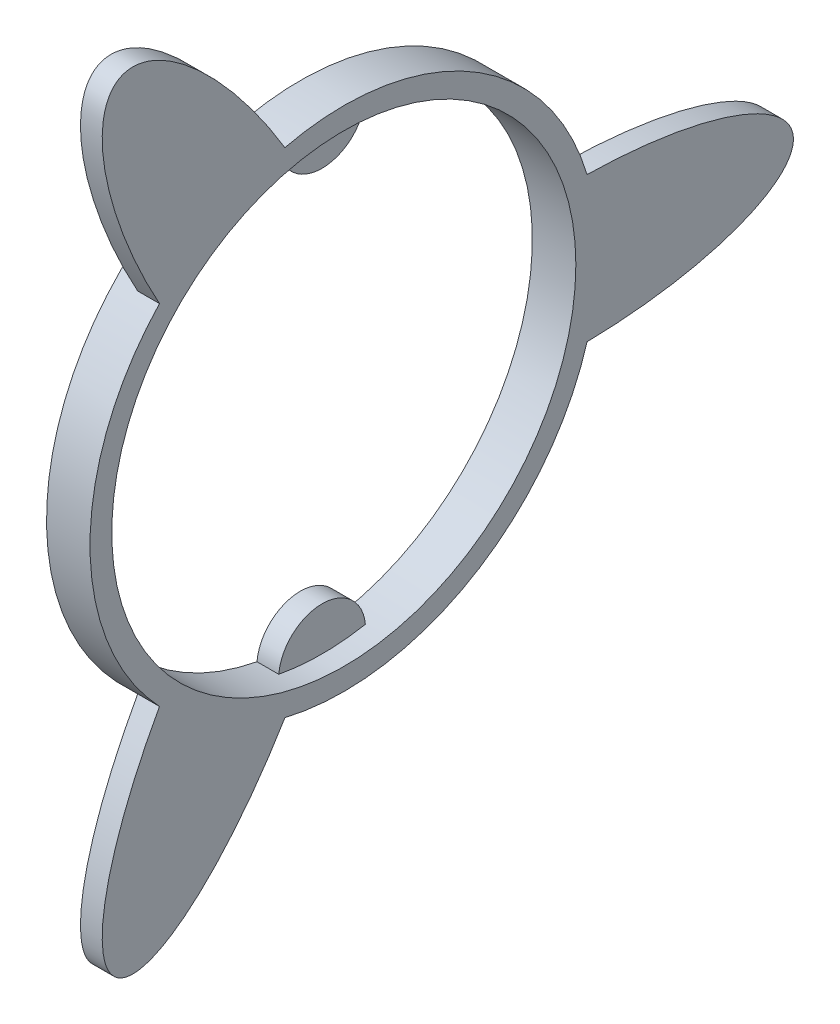
ISO-10303-21;
HEADER;
FILE_DESCRIPTION(('STEP AP214'),'2;1');
FILE_NAME('part.step','',(''),(''),'','','');
FILE_SCHEMA(('AUTOMOTIVE_DESIGN { 1 0 10303 214 1 1 1 1 }'));
ENDSEC;
DATA;
#1=APPLICATION_CONTEXT('core data for automotive mechanical design processes');
#2=APPLICATION_PROTOCOL_DEFINITION('international standard','automotive_design',2000,#1);
#3=PRODUCT_CONTEXT('',#1,'mechanical');
#4=PRODUCT('Part','Part','',(#3));
#5=PRODUCT_RELATED_PRODUCT_CATEGORY('part','',(#4));
#6=PRODUCT_DEFINITION_FORMATION('','',#4);
#7=PRODUCT_DEFINITION_CONTEXT('part definition',#1,'design');
#8=PRODUCT_DEFINITION('design','',#6,#7);
#9=PRODUCT_DEFINITION_SHAPE('','',#8);
#10=(LENGTH_UNIT() NAMED_UNIT(*) SI_UNIT(.MILLI.,.METRE.));
#11=(NAMED_UNIT(*) PLANE_ANGLE_UNIT() SI_UNIT($,.RADIAN.));
#12=(NAMED_UNIT(*) SI_UNIT($,.STERADIAN.) SOLID_ANGLE_UNIT());
#13=UNCERTAINTY_MEASURE_WITH_UNIT(LENGTH_MEASURE(1.E-05),#10,'distance_accuracy_value','');
#14=(GEOMETRIC_REPRESENTATION_CONTEXT(3) GLOBAL_UNCERTAINTY_ASSIGNED_CONTEXT((#13)) GLOBAL_UNIT_ASSIGNED_CONTEXT((#10,
#11,#12)) REPRESENTATION_CONTEXT('',''));
#15=CARTESIAN_POINT('',(0.,0.,0.));
#16=DIRECTION('',(0.,0.,1.));
#17=DIRECTION('',(1.,0.,0.));
#18=AXIS2_PLACEMENT_3D('',#15,#16,#17);
#19=CARTESIAN_POINT('',(3.,0.,0.));
#20=DIRECTION('',(-1.,0.,0.));
#21=DIRECTION('',(0.,0.,1.));
#22=AXIS2_PLACEMENT_3D('',#19,#20,#21);
#23=CYLINDRICAL_SURFACE('',#22,17.5);
#24=CARTESIAN_POINT('',(0.,0.,0.));
#25=DIRECTION('',(1.,0.,0.));
#26=DIRECTION('',(0.,0.,-1.));
#27=AXIS2_PLACEMENT_3D('',#24,#25,#26);
#28=CIRCLE('',#27,17.5);
#29=CARTESIAN_POINT('',(0.,0.,-17.5));
#30=VERTEX_POINT('',#29);
#31=EDGE_CURVE('E144',#30,#30,#28,.T.);
#32=ORIENTED_EDGE('',*,*,#31,.T.);
#33=EDGE_LOOP('',(#32));
#34=FACE_BOUND('',#33,.T.);
#35=CARTESIAN_POINT('',(1.5,0.,0.));
#36=DIRECTION('',(1.,0.,0.));
#37=DIRECTION('',(0.,0.,-1.));
#38=AXIS2_PLACEMENT_3D('',#35,#36,#37);
#39=CIRCLE('',#38,17.5);
#40=CARTESIAN_POINT('',(1.5,-12.0287168054307,12.7106243754879));
#41=VERTEX_POINT('',#40);
#42=CARTESIAN_POINT('',(1.5,-17.0220820098497,4.06186214068753));
#43=VERTEX_POINT('',#42);
#44=EDGE_CURVE('E345',#41,#43,#39,.T.);
#45=ORIENTED_EDGE('',*,*,#44,.F.);
#46=DIRECTION('',(1.,0.,0.));
#47=VECTOR('',#46,1.);
#48=CARTESIAN_POINT('',(1.5,-12.0287168054307,12.7106243754879));
#49=LINE('',#48,#47);
#50=CARTESIAN_POINT('',(3.,-12.0287168054307,12.7106243754879));
#51=VERTEX_POINT('',#50);
#52=EDGE_CURVE('E344',#41,#51,#49,.T.);
#53=ORIENTED_EDGE('',*,*,#52,.T.);
#54=CARTESIAN_POINT('',(3.,0.,0.));
#55=DIRECTION('',(1.,0.,0.));
#56=DIRECTION('',(0.,0.,-1.));
#57=AXIS2_PLACEMENT_3D('',#54,#55,#56);
#58=CIRCLE('',#57,17.5);
#59=CARTESIAN_POINT('',(3.,12.0287168054307,12.7106243754879));
#60=VERTEX_POINT('',#59);
#61=EDGE_CURVE('E149',#60,#51,#58,.T.);
#62=ORIENTED_EDGE('',*,*,#61,.F.);
#63=DIRECTION('',(1.,0.,0.));
#64=VECTOR('',#63,1.);
#65=CARTESIAN_POINT('',(1.5,12.0287168054307,12.7106243754879));
#66=LINE('',#65,#64);
#67=CARTESIAN_POINT('',(1.5,12.0287168054307,12.7106243754879));
#68=VERTEX_POINT('',#67);
#69=EDGE_CURVE('E189',#68,#60,#66,.T.);
#70=ORIENTED_EDGE('',*,*,#69,.F.);
#71=CARTESIAN_POINT('',(1.5,0.,0.));
#72=DIRECTION('',(1.,0.,0.));
#73=DIRECTION('',(0.,0.,-1.));
#74=AXIS2_PLACEMENT_3D('',#71,#72,#73);
#75=CIRCLE('',#74,17.5);
#76=CARTESIAN_POINT('',(1.5,17.0220820098497,4.06186214068754));
#77=VERTEX_POINT('',#76);
#78=EDGE_CURVE('E196',#77,#68,#75,.T.);
#79=ORIENTED_EDGE('',*,*,#78,.F.);
#80=DIRECTION('',(1.,0.,0.));
#81=VECTOR('',#80,1.);
#82=CARTESIAN_POINT('',(1.5,17.0220820098497,4.06186214068754));
#83=LINE('',#82,#81);
#84=CARTESIAN_POINT('',(3.,17.0220820098497,4.06186214068754));
#85=VERTEX_POINT('',#84);
#86=EDGE_CURVE('E146',#77,#85,#83,.T.);
#87=ORIENTED_EDGE('',*,*,#86,.T.);
#88=CARTESIAN_POINT('',(3.,4.99336520441905,-16.7724865161757));
#89=VERTEX_POINT('',#88);
#90=EDGE_CURVE('E154',#89,#85,#58,.T.);
#91=ORIENTED_EDGE('',*,*,#90,.F.);
#92=DIRECTION('',(1.,0.,0.));
#93=VECTOR('',#92,1.);
#94=CARTESIAN_POINT('',(1.5,4.99336520441905,-16.7724865161757));
#95=LINE('',#94,#93);
#96=CARTESIAN_POINT('',(1.5,4.99336520441905,-16.7724865161757));
#97=VERTEX_POINT('',#96);
#98=EDGE_CURVE('E193',#97,#89,#95,.T.);
#99=ORIENTED_EDGE('',*,*,#98,.F.);
#100=CARTESIAN_POINT('',(1.5,0.,0.));
#101=DIRECTION('',(1.,0.,0.));
#102=DIRECTION('',(0.,0.,-1.));
#103=AXIS2_PLACEMENT_3D('',#100,#101,#102);
#104=CIRCLE('',#103,17.5);
#105=CARTESIAN_POINT('',(1.5,-4.99336520441905,-16.7724865161757));
#106=VERTEX_POINT('',#105);
#107=EDGE_CURVE('E356',#106,#97,#104,.T.);
#108=ORIENTED_EDGE('',*,*,#107,.F.);
#109=DIRECTION('',(1.,0.,0.));
#110=VECTOR('',#109,1.);
#111=CARTESIAN_POINT('',(1.5,-4.99336520441905,-16.7724865161757));
#112=LINE('',#111,#110);
#113=CARTESIAN_POINT('',(3.,-4.99336520441905,-16.7724865161757));
#114=VERTEX_POINT('',#113);
#115=EDGE_CURVE('E206',#106,#114,#112,.T.);
#116=ORIENTED_EDGE('',*,*,#115,.T.);
#117=CARTESIAN_POINT('',(3.,-17.0220820098497,4.06186214068753));
#118=VERTEX_POINT('',#117);
#119=EDGE_CURVE('E153',#118,#114,#58,.T.);
#120=ORIENTED_EDGE('',*,*,#119,.F.);
#121=DIRECTION('',(1.,0.,0.));
#122=VECTOR('',#121,1.);
#123=CARTESIAN_POINT('',(1.5,-17.0220820098497,4.06186214068753));
#124=LINE('',#123,#122);
#125=EDGE_CURVE('E350',#43,#118,#124,.T.);
#126=ORIENTED_EDGE('',*,*,#125,.F.);
#127=EDGE_LOOP('',(#45,#53,#62,#70,#79,#87,#91,#99,#108,#116,#120,#126));
#128=FACE_BOUND('',#127,.T.);
#129=ADVANCED_FACE('F41',(#34,#128),#23,.T.);
#130=CARTESIAN_POINT('',(3.,0.,0.));
#131=DIRECTION('',(1.,0.,0.));
#132=DIRECTION('',(0.,0.,-1.));
#133=AXIS2_PLACEMENT_3D('',#130,#131,#132);
#134=PLANE('',#133);
#135=ORIENTED_EDGE('',*,*,#61,.T.);
#136=CARTESIAN_POINT('',(3.,-13.8564064605511,7.99999999999987));
#137=DIRECTION('',(1.,0.,0.));
#138=DIRECTION('',(0.,0.866025403784443,-0.499999999999992));
#139=AXIS2_PLACEMENT_3D('',#136,#137,#138);
#140=ELLIPSE('',#139,15.,5.);
#141=EDGE_CURVE('E64',#51,#118,#140,.T.);
#142=ORIENTED_EDGE('',*,*,#141,.T.);
#143=ORIENTED_EDGE('',*,*,#119,.T.);
#144=CARTESIAN_POINT('',(3.,0.,-16.));
#145=DIRECTION('',(1.,0.,0.));
#146=DIRECTION('',(0.,0.,1.));
#147=AXIS2_PLACEMENT_3D('',#144,#145,#146);
#148=ELLIPSE('',#147,15.,5.);
#149=EDGE_CURVE('E178',#114,#89,#148,.T.);
#150=ORIENTED_EDGE('',*,*,#149,.T.);
#151=ORIENTED_EDGE('',*,*,#90,.T.);
#152=CARTESIAN_POINT('',(3.,13.8564064605511,7.99999999999987));
#153=DIRECTION('',(-1.,0.,0.));
#154=DIRECTION('',(0.,-0.866025403784443,-0.499999999999992));
#155=AXIS2_PLACEMENT_3D('',#152,#153,#154);
#156=ELLIPSE('',#155,15.,5.);
#157=EDGE_CURVE('E175',#60,#85,#156,.T.);
#158=ORIENTED_EDGE('',*,*,#157,.F.);
#159=EDGE_LOOP('',(#135,#142,#143,#150,#151,#158));
#160=FACE_BOUND('',#159,.T.);
#161=CARTESIAN_POINT('',(3.,0.,0.));
#162=DIRECTION('',(1.,0.,0.));
#163=DIRECTION('',(0.,0.,-1.));
#164=AXIS2_PLACEMENT_3D('',#161,#162,#163);
#165=CIRCLE('',#164,16.);
#166=CARTESIAN_POINT('',(3.,0.,-16.));
#167=VERTEX_POINT('',#166);
#168=EDGE_CURVE('E138',#167,#167,#165,.T.);
#169=ORIENTED_EDGE('',*,*,#168,.F.);
#170=EDGE_LOOP('',(#169));
#171=FACE_BOUND('',#170,.T.);
#172=ADVANCED_FACE('F173',(#160,#171),#134,.T.);
#173=CARTESIAN_POINT('',(0.,0.,0.));
#174=DIRECTION('',(1.,0.,0.));
#175=DIRECTION('',(0.,0.,-1.));
#176=AXIS2_PLACEMENT_3D('',#173,#174,#175);
#177=PLANE('',#176);
#178=CARTESIAN_POINT('',(0.,-16.,0.));
#179=DIRECTION('',(-1.,0.,0.));
#180=DIRECTION('',(0.,0.,1.));
#181=AXIS2_PLACEMENT_3D('',#178,#179,#180);
#182=CIRCLE('',#181,3.);
#183=CARTESIAN_POINT('',(0.,-15.71875,2.98678731038887));
#184=VERTEX_POINT('',#183);
#185=CARTESIAN_POINT('',(0.,-15.71875,-2.98678731038887));
#186=VERTEX_POINT('',#185);
#187=EDGE_CURVE('E117',#184,#186,#182,.T.);
#188=ORIENTED_EDGE('',*,*,#187,.T.);
#189=CARTESIAN_POINT('',(0.,0.,0.));
#190=DIRECTION('',(1.,0.,0.));
#191=DIRECTION('',(0.,0.,-1.));
#192=AXIS2_PLACEMENT_3D('',#189,#190,#191);
#193=CIRCLE('',#192,16.);
#194=CARTESIAN_POINT('',(0.,15.71875,-2.98678731038887));
#195=VERTEX_POINT('',#194);
#196=EDGE_CURVE('E139',#186,#195,#193,.T.);
#197=ORIENTED_EDGE('',*,*,#196,.T.);
#198=CARTESIAN_POINT('',(0.,16.,0.));
#199=DIRECTION('',(-1.,0.,0.));
#200=DIRECTION('',(0.,0.,-1.));
#201=AXIS2_PLACEMENT_3D('',#198,#199,#200);
#202=CIRCLE('',#201,3.);
#203=CARTESIAN_POINT('',(0.,15.71875,2.98678731038887));
#204=VERTEX_POINT('',#203);
#205=EDGE_CURVE('E56',#195,#204,#202,.T.);
#206=ORIENTED_EDGE('',*,*,#205,.T.);
#207=EDGE_CURVE('E133',#204,#184,#193,.T.);
#208=ORIENTED_EDGE('',*,*,#207,.T.);
#209=EDGE_LOOP('',(#188,#197,#206,#208));
#210=FACE_BOUND('',#209,.T.);
#211=ORIENTED_EDGE('',*,*,#31,.F.);
#212=EDGE_LOOP('',(#211));
#213=FACE_BOUND('',#212,.T.);
#214=ADVANCED_FACE('F135',(#210,#213),#177,.F.);
#215=CARTESIAN_POINT('',(3.,0.,0.));
#216=DIRECTION('',(-1.,0.,0.));
#217=DIRECTION('',(0.,0.,1.));
#218=AXIS2_PLACEMENT_3D('',#215,#216,#217);
#219=CYLINDRICAL_SURFACE('',#218,16.);
#220=DIRECTION('',(-1.,0.,0.));
#221=VECTOR('',#220,1.);
#222=CARTESIAN_POINT('',(0.75,-15.71875,2.98678731038887));
#223=LINE('',#222,#221);
#224=CARTESIAN_POINT('',(1.5,-15.71875,2.98678731038887));
#225=VERTEX_POINT('',#224);
#226=EDGE_CURVE('E11',#184,#225,#223,.F.);
#227=ORIENTED_EDGE('',*,*,#226,.F.);
#228=ORIENTED_EDGE('',*,*,#207,.F.);
#229=DIRECTION('',(-1.,0.,0.));
#230=VECTOR('',#229,1.);
#231=CARTESIAN_POINT('',(0.75,15.71875,2.98678731038887));
#232=LINE('',#231,#230);
#233=CARTESIAN_POINT('',(1.5,15.71875,2.98678731038887));
#234=VERTEX_POINT('',#233);
#235=EDGE_CURVE('E160',#234,#204,#232,.T.);
#236=ORIENTED_EDGE('',*,*,#235,.F.);
#237=CARTESIAN_POINT('',(1.5,0.,0.));
#238=DIRECTION('',(1.,0.,0.));
#239=DIRECTION('',(0.,0.,-1.));
#240=AXIS2_PLACEMENT_3D('',#237,#238,#239);
#241=CIRCLE('',#240,16.);
#242=CARTESIAN_POINT('',(1.5,15.71875,-2.98678731038887));
#243=VERTEX_POINT('',#242);
#244=EDGE_CURVE('E152',#243,#234,#241,.T.);
#245=ORIENTED_EDGE('',*,*,#244,.F.);
#246=DIRECTION('',(-1.,0.,0.));
#247=VECTOR('',#246,1.);
#248=CARTESIAN_POINT('',(0.75,15.71875,-2.98678731038887));
#249=LINE('',#248,#247);
#250=EDGE_CURVE('E163',#195,#243,#249,.F.);
#251=ORIENTED_EDGE('',*,*,#250,.F.);
#252=ORIENTED_EDGE('',*,*,#196,.F.);
#253=DIRECTION('',(-1.,0.,0.));
#254=VECTOR('',#253,1.);
#255=CARTESIAN_POINT('',(0.75,-15.71875,-2.98678731038887));
#256=LINE('',#255,#254);
#257=CARTESIAN_POINT('',(1.5,-15.71875,-2.98678731038887));
#258=VERTEX_POINT('',#257);
#259=EDGE_CURVE('E49',#258,#186,#256,.T.);
#260=ORIENTED_EDGE('',*,*,#259,.F.);
#261=CARTESIAN_POINT('',(1.5,0.,0.));
#262=DIRECTION('',(-1.,0.,0.));
#263=DIRECTION('',(0.,0.,1.));
#264=AXIS2_PLACEMENT_3D('',#261,#262,#263);
#265=CIRCLE('',#264,16.);
#266=EDGE_CURVE('E134',#258,#225,#265,.T.);
#267=ORIENTED_EDGE('',*,*,#266,.T.);
#268=EDGE_LOOP('',(#227,#228,#236,#245,#251,#252,#260,#267));
#269=FACE_BOUND('',#268,.T.);
#270=ORIENTED_EDGE('',*,*,#168,.T.);
#271=EDGE_LOOP('',(#270));
#272=FACE_BOUND('',#271,.T.);
#273=ADVANCED_FACE('F130',(#269,#272),#219,.F.);
#274=CARTESIAN_POINT('',(1.5,13.8564064605511,7.99999999999987));
#275=DIRECTION('',(-1.,0.,0.));
#276=DIRECTION('',(0.,-0.866025403784443,-0.499999999999992));
#277=AXIS2_PLACEMENT_3D('',#274,#275,#276);
#278=ELLIPSE('',#277,15.,5.);
#279=DIRECTION('',(1.,0.,0.));
#280=VECTOR('',#279,1.);
#281=SURFACE_OF_LINEAR_EXTRUSION('',#278,#280);
#282=ORIENTED_EDGE('',*,*,#157,.T.);
#283=ORIENTED_EDGE('',*,*,#86,.F.);
#284=EDGE_CURVE('E192',#68,#77,#278,.T.);
#285=ORIENTED_EDGE('',*,*,#284,.F.);
#286=ORIENTED_EDGE('',*,*,#69,.T.);
#287=EDGE_LOOP('',(#282,#283,#285,#286));
#288=FACE_BOUND('',#287,.T.);
#289=ADVANCED_FACE('F185',(#288),#281,.F.);
#290=CARTESIAN_POINT('',(1.5,0.,0.));
#291=DIRECTION('',(1.,0.,0.));
#292=DIRECTION('',(0.,0.,-1.));
#293=AXIS2_PLACEMENT_3D('',#290,#291,#292);
#294=PLANE('',#293);
#295=ORIENTED_EDGE('',*,*,#284,.T.);
#296=ORIENTED_EDGE('',*,*,#78,.T.);
#297=EDGE_LOOP('',(#295,#296));
#298=FACE_BOUND('',#297,.T.);
#299=ADVANCED_FACE('F212',(#298),#294,.F.);
#300=CARTESIAN_POINT('',(1.5,0.,-16.));
#301=DIRECTION('',(1.,0.,0.));
#302=DIRECTION('',(0.,0.,1.));
#303=AXIS2_PLACEMENT_3D('',#300,#301,#302);
#304=ELLIPSE('',#303,15.,5.);
#305=DIRECTION('',(1.,0.,0.));
#306=VECTOR('',#305,1.);
#307=SURFACE_OF_LINEAR_EXTRUSION('',#304,#306);
#308=ORIENTED_EDGE('',*,*,#149,.F.);
#309=ORIENTED_EDGE('',*,*,#115,.F.);
#310=EDGE_CURVE('E359',#106,#97,#304,.T.);
#311=ORIENTED_EDGE('',*,*,#310,.T.);
#312=ORIENTED_EDGE('',*,*,#98,.T.);
#313=EDGE_LOOP('',(#308,#309,#311,#312));
#314=FACE_BOUND('',#313,.T.);
#315=ADVANCED_FACE('F245',(#314),#307,.T.);
#316=CARTESIAN_POINT('',(1.5,0.,0.));
#317=DIRECTION('',(1.,0.,0.));
#318=DIRECTION('',(0.,0.,-1.));
#319=AXIS2_PLACEMENT_3D('',#316,#317,#318);
#320=PLANE('',#319);
#321=ORIENTED_EDGE('',*,*,#107,.T.);
#322=ORIENTED_EDGE('',*,*,#310,.F.);
#323=EDGE_LOOP('',(#321,#322));
#324=FACE_BOUND('',#323,.T.);
#325=ADVANCED_FACE('F254',(#324),#320,.F.);
#326=CARTESIAN_POINT('',(1.5,-13.8564064605511,7.99999999999987));
#327=DIRECTION('',(1.,0.,0.));
#328=DIRECTION('',(0.,0.866025403784443,-0.499999999999992));
#329=AXIS2_PLACEMENT_3D('',#326,#327,#328);
#330=ELLIPSE('',#329,15.,5.);
#331=DIRECTION('',(1.,0.,0.));
#332=VECTOR('',#331,1.);
#333=SURFACE_OF_LINEAR_EXTRUSION('',#330,#332);
#334=ORIENTED_EDGE('',*,*,#141,.F.);
#335=ORIENTED_EDGE('',*,*,#52,.F.);
#336=EDGE_CURVE('E338',#41,#43,#330,.T.);
#337=ORIENTED_EDGE('',*,*,#336,.T.);
#338=ORIENTED_EDGE('',*,*,#125,.T.);
#339=EDGE_LOOP('',(#334,#335,#337,#338));
#340=FACE_BOUND('',#339,.T.);
#341=ADVANCED_FACE('F263',(#340),#333,.T.);
#342=CARTESIAN_POINT('',(1.5,0.,0.));
#343=DIRECTION('',(1.,0.,0.));
#344=DIRECTION('',(0.,0.,-1.));
#345=AXIS2_PLACEMENT_3D('',#342,#343,#344);
#346=PLANE('',#345);
#347=ORIENTED_EDGE('',*,*,#44,.T.);
#348=ORIENTED_EDGE('',*,*,#336,.F.);
#349=EDGE_LOOP('',(#347,#348));
#350=FACE_BOUND('',#349,.T.);
#351=ADVANCED_FACE('F273',(#350),#346,.F.);
#352=CARTESIAN_POINT('',(1.5,16.,0.));
#353=DIRECTION('',(1.,0.,0.));
#354=DIRECTION('',(0.,0.,-1.));
#355=AXIS2_PLACEMENT_3D('',#352,#353,#354);
#356=PLANE('',#355);
#357=CARTESIAN_POINT('',(1.5,16.,0.));
#358=DIRECTION('',(-1.,0.,0.));
#359=DIRECTION('',(0.,0.,-1.));
#360=AXIS2_PLACEMENT_3D('',#357,#358,#359);
#361=CIRCLE('',#360,3.);
#362=EDGE_CURVE('E349',#243,#234,#361,.T.);
#363=ORIENTED_EDGE('',*,*,#362,.F.);
#364=ORIENTED_EDGE('',*,*,#244,.T.);
#365=EDGE_LOOP('',(#363,#364));
#366=FACE_BOUND('',#365,.T.);
#367=ADVANCED_FACE('F282',(#366),#356,.T.);
#368=CARTESIAN_POINT('',(1.5,16.,0.));
#369=DIRECTION('',(-1.,0.,0.));
#370=DIRECTION('',(0.,0.,1.));
#371=AXIS2_PLACEMENT_3D('',#368,#369,#370);
#372=CYLINDRICAL_SURFACE('',#371,3.);
#373=ORIENTED_EDGE('',*,*,#205,.F.);
#374=ORIENTED_EDGE('',*,*,#250,.T.);
#375=ORIENTED_EDGE('',*,*,#362,.T.);
#376=ORIENTED_EDGE('',*,*,#235,.T.);
#377=EDGE_LOOP('',(#373,#374,#375,#376));
#378=FACE_BOUND('',#377,.T.);
#379=ADVANCED_FACE('F305',(#378),#372,.T.);
#380=CARTESIAN_POINT('',(1.5,-16.,0.));
#381=DIRECTION('',(-1.,0.,0.));
#382=DIRECTION('',(0.,0.,1.));
#383=AXIS2_PLACEMENT_3D('',#380,#381,#382);
#384=PLANE('',#383);
#385=ORIENTED_EDGE('',*,*,#266,.F.);
#386=CARTESIAN_POINT('',(1.5,-16.,0.));
#387=DIRECTION('',(-1.,0.,0.));
#388=DIRECTION('',(0.,0.,1.));
#389=AXIS2_PLACEMENT_3D('',#386,#387,#388);
#390=CIRCLE('',#389,3.);
#391=EDGE_CURVE('E125',#225,#258,#390,.T.);
#392=ORIENTED_EDGE('',*,*,#391,.F.);
#393=EDGE_LOOP('',(#385,#392));
#394=FACE_BOUND('',#393,.T.);
#395=ADVANCED_FACE('F315',(#394),#384,.F.);
#396=CARTESIAN_POINT('',(1.5,-16.,0.));
#397=DIRECTION('',(-1.,0.,0.));
#398=DIRECTION('',(0.,0.,1.));
#399=AXIS2_PLACEMENT_3D('',#396,#397,#398);
#400=CYLINDRICAL_SURFACE('',#399,3.);
#401=ORIENTED_EDGE('',*,*,#187,.F.);
#402=ORIENTED_EDGE('',*,*,#226,.T.);
#403=ORIENTED_EDGE('',*,*,#391,.T.);
#404=ORIENTED_EDGE('',*,*,#259,.T.);
#405=EDGE_LOOP('',(#401,#402,#403,#404));
#406=FACE_BOUND('',#405,.T.);
#407=ADVANCED_FACE('F119',(#406),#400,.T.);
#408=CLOSED_SHELL('',(#129,#172,#214,#273,#289,#299,#315,#325,#341,#351,#367,#379,#395,#407));
#409=MANIFOLD_SOLID_BREP('B2',#408);
#410=ADVANCED_BREP_SHAPE_REPRESENTATION('',(#18,#409),#14);
#411=SHAPE_DEFINITION_REPRESENTATION(#9,#410);
ENDSEC;
END-ISO-10303-21;
